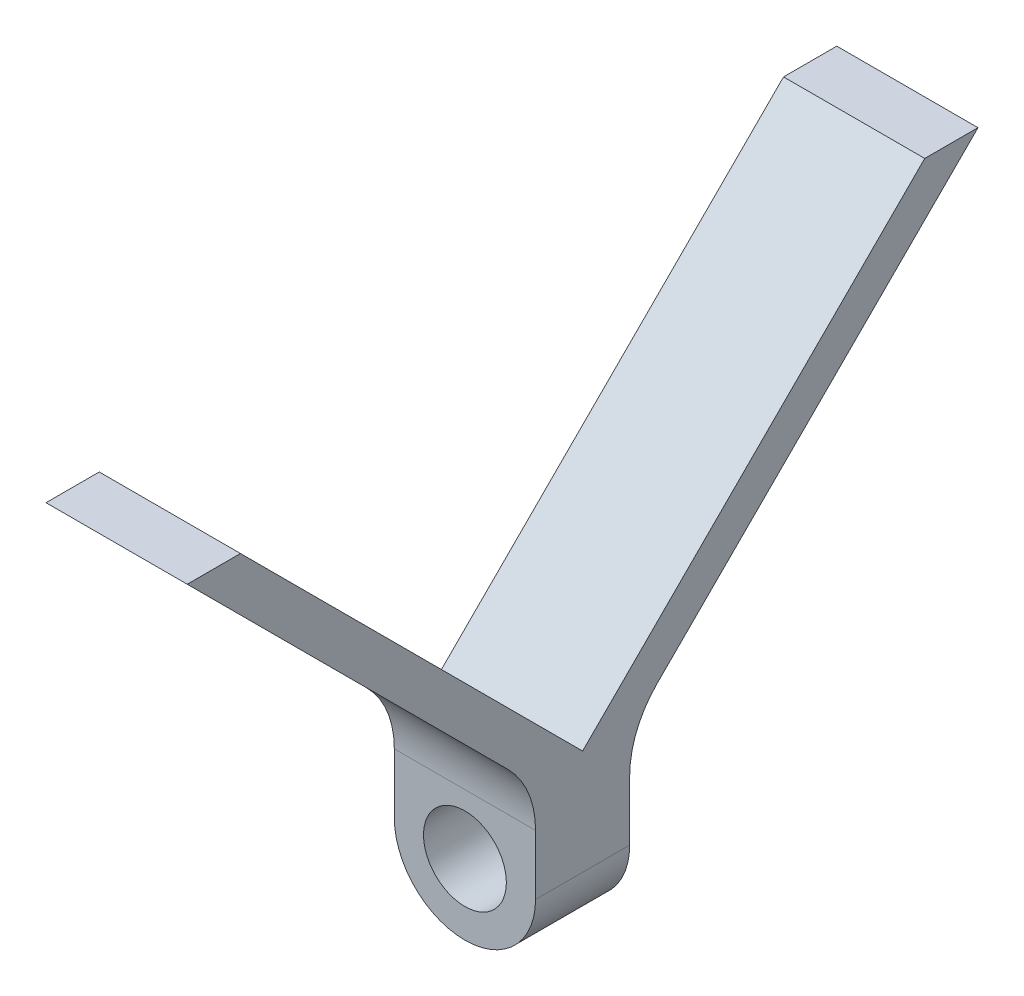
ISO-10303-21;
HEADER;
FILE_DESCRIPTION(('STEP AP214'),'2;1');
FILE_NAME('part.step','',(''),(''),'','','');
FILE_SCHEMA(('AUTOMOTIVE_DESIGN { 1 0 10303 214 1 1 1 1 }'));
ENDSEC;
DATA;
#1=APPLICATION_CONTEXT('core data for automotive mechanical design processes');
#2=APPLICATION_PROTOCOL_DEFINITION('international standard','automotive_design',2000,#1);
#3=PRODUCT_CONTEXT('',#1,'mechanical');
#4=PRODUCT('Part','Part','',(#3));
#5=PRODUCT_RELATED_PRODUCT_CATEGORY('part','',(#4));
#6=PRODUCT_DEFINITION_FORMATION('','',#4);
#7=PRODUCT_DEFINITION_CONTEXT('part definition',#1,'design');
#8=PRODUCT_DEFINITION('design','',#6,#7);
#9=PRODUCT_DEFINITION_SHAPE('','',#8);
#10=(LENGTH_UNIT() NAMED_UNIT(*) SI_UNIT(.MILLI.,.METRE.));
#11=(NAMED_UNIT(*) PLANE_ANGLE_UNIT() SI_UNIT($,.RADIAN.));
#12=(NAMED_UNIT(*) SI_UNIT($,.STERADIAN.) SOLID_ANGLE_UNIT());
#13=UNCERTAINTY_MEASURE_WITH_UNIT(LENGTH_MEASURE(1.E-05),#10,'distance_accuracy_value','');
#14=(GEOMETRIC_REPRESENTATION_CONTEXT(3) GLOBAL_UNCERTAINTY_ASSIGNED_CONTEXT((#13)) GLOBAL_UNIT_ASSIGNED_CONTEXT((#10,
#11,#12)) REPRESENTATION_CONTEXT('',''));
#15=CARTESIAN_POINT('',(0.,0.,0.));
#16=DIRECTION('',(0.,0.,1.));
#17=DIRECTION('',(1.,0.,0.));
#18=AXIS2_PLACEMENT_3D('',#15,#16,#17);
#19=CARTESIAN_POINT('',(3.75,3.75,2.5));
#20=DIRECTION('',(-1.,0.,0.));
#21=DIRECTION('',(0.,0.,1.));
#22=AXIS2_PLACEMENT_3D('',#19,#20,#21);
#23=PLANE('',#22);
#24=DIRECTION('',(0.,0.707106781186549,0.707106781186546));
#25=VECTOR('',#24,1.);
#26=CARTESIAN_POINT('',(3.75,23.75,20.9999999999999));
#27=LINE('',#26,#25);
#28=CARTESIAN_POINT('',(3.75,6.71446609406726,3.96446609406725));
#29=VERTEX_POINT('',#28);
#30=CARTESIAN_POINT('',(3.75,23.75,20.9999999999999));
#31=VERTEX_POINT('',#30);
#32=EDGE_CURVE('E170',#29,#31,#27,.T.);
#33=ORIENTED_EDGE('',*,*,#32,.F.);
#34=CARTESIAN_POINT('',(3.75,3.17893218813454,7.5));
#35=DIRECTION('',(-1.,0.,0.));
#36=DIRECTION('',(0.,0.,1.));
#37=AXIS2_PLACEMENT_3D('',#34,#35,#36);
#38=CIRCLE('',#37,5.);
#39=CARTESIAN_POINT('',(3.75,3.17893218813454,2.5));
#40=VERTEX_POINT('',#39);
#41=EDGE_CURVE('E48',#29,#40,#38,.T.);
#42=ORIENTED_EDGE('',*,*,#41,.T.);
#43=DIRECTION('',(0.,1.,0.));
#44=VECTOR('',#43,1.);
#45=CARTESIAN_POINT('',(3.75,3.75,2.5));
#46=LINE('',#45,#44);
#47=CARTESIAN_POINT('',(3.75,0.,2.5));
#48=VERTEX_POINT('',#47);
#49=EDGE_CURVE('E187',#48,#40,#46,.T.);
#50=ORIENTED_EDGE('',*,*,#49,.F.);
#51=DIRECTION('',(0.,0.,-1.));
#52=VECTOR('',#51,1.);
#53=CARTESIAN_POINT('',(3.75,0.,2.5));
#54=LINE('',#53,#52);
#55=CARTESIAN_POINT('',(3.75,0.,-2.5));
#56=VERTEX_POINT('',#55);
#57=EDGE_CURVE('E207',#48,#56,#54,.T.);
#58=ORIENTED_EDGE('',*,*,#57,.T.);
#59=DIRECTION('',(0.,1.,0.));
#60=VECTOR('',#59,1.);
#61=CARTESIAN_POINT('',(3.75,3.75,-2.5));
#62=LINE('',#61,#60);
#63=CARTESIAN_POINT('',(3.75,3.17893218813454,-2.5));
#64=VERTEX_POINT('',#63);
#65=EDGE_CURVE('E198',#56,#64,#62,.T.);
#66=ORIENTED_EDGE('',*,*,#65,.T.);
#67=CARTESIAN_POINT('',(3.75,3.17893218813454,-7.5));
#68=DIRECTION('',(-1.,0.,0.));
#69=DIRECTION('',(0.,0.,1.));
#70=AXIS2_PLACEMENT_3D('',#67,#68,#69);
#71=CIRCLE('',#70,5.);
#72=CARTESIAN_POINT('',(3.75,6.71446609406727,-3.96446609406726));
#73=VERTEX_POINT('',#72);
#74=EDGE_CURVE('E229',#64,#73,#71,.T.);
#75=ORIENTED_EDGE('',*,*,#74,.T.);
#76=DIRECTION('',(0.,-0.707106781186549,0.707106781186546));
#77=VECTOR('',#76,1.);
#78=CARTESIAN_POINT('',(3.75,2.75,0.));
#79=LINE('',#78,#77);
#80=CARTESIAN_POINT('',(3.75,23.75,-20.9999999999999));
#81=VERTEX_POINT('',#80);
#82=EDGE_CURVE('E166',#81,#73,#79,.T.);
#83=ORIENTED_EDGE('',*,*,#82,.F.);
#84=DIRECTION('',(0.,0.,-1.));
#85=VECTOR('',#84,1.);
#86=CARTESIAN_POINT('',(3.75,23.75,-20.9999999999999));
#87=LINE('',#86,#85);
#88=CARTESIAN_POINT('',(3.75,23.75,-18.1715728752538));
#89=VERTEX_POINT('',#88);
#90=EDGE_CURVE('E180',#89,#81,#87,.T.);
#91=ORIENTED_EDGE('',*,*,#90,.F.);
#92=DIRECTION('',(0.,0.707106781186548,-0.707106781186547));
#93=VECTOR('',#92,1.);
#94=CARTESIAN_POINT('',(3.75,3.41421356237309,2.16421356237309));
#95=LINE('',#94,#93);
#96=CARTESIAN_POINT('',(3.75,5.57842712474619,0.));
#97=VERTEX_POINT('',#96);
#98=EDGE_CURVE('E266',#97,#89,#95,.T.);
#99=ORIENTED_EDGE('',*,*,#98,.F.);
#100=DIRECTION('',(0.,-0.707106781186547,-0.707106781186548));
#101=VECTOR('',#100,1.);
#102=CARTESIAN_POINT('',(3.75,5.9142135623731,0.335786437626903));
#103=LINE('',#102,#101);
#104=CARTESIAN_POINT('',(3.75,23.75,18.1715728752538));
#105=VERTEX_POINT('',#104);
#106=EDGE_CURVE('E159',#105,#97,#103,.T.);
#107=ORIENTED_EDGE('',*,*,#106,.F.);
#108=EDGE_CURVE('E142',#31,#105,#87,.T.);
#109=ORIENTED_EDGE('',*,*,#108,.F.);
#110=EDGE_LOOP('',(#33,#42,#50,#58,#66,#75,#83,#91,#99,#107,#109));
#111=FACE_BOUND('',#110,.T.);
#112=ADVANCED_FACE('F39',(#111),#23,.F.);
#113=CARTESIAN_POINT('',(-3.75,0.,2.5));
#114=DIRECTION('',(1.,0.,0.));
#115=DIRECTION('',(0.,0.,-1.));
#116=AXIS2_PLACEMENT_3D('',#113,#114,#115);
#117=PLANE('',#116);
#118=DIRECTION('',(0.,-0.707106781186549,0.707106781186546));
#119=VECTOR('',#118,1.);
#120=CARTESIAN_POINT('',(-3.75,2.75,0.));
#121=LINE('',#120,#119);
#122=CARTESIAN_POINT('',(-3.75,23.75,-20.9999999999999));
#123=VERTEX_POINT('',#122);
#124=CARTESIAN_POINT('',(-3.75,6.71446609406727,-3.96446609406726));
#125=VERTEX_POINT('',#124);
#126=EDGE_CURVE('E157',#123,#125,#121,.T.);
#127=ORIENTED_EDGE('',*,*,#126,.T.);
#128=CARTESIAN_POINT('',(-3.75,3.17893218813454,-7.5));
#129=DIRECTION('',(1.,0.,0.));
#130=DIRECTION('',(0.,0.,-1.));
#131=AXIS2_PLACEMENT_3D('',#128,#129,#130);
#132=CIRCLE('',#131,5.);
#133=CARTESIAN_POINT('',(-3.75,3.17893218813454,-2.5));
#134=VERTEX_POINT('',#133);
#135=EDGE_CURVE('E232',#125,#134,#132,.T.);
#136=ORIENTED_EDGE('',*,*,#135,.T.);
#137=DIRECTION('',(0.,-1.,0.));
#138=VECTOR('',#137,1.);
#139=CARTESIAN_POINT('',(-3.75,0.,-2.5));
#140=LINE('',#139,#138);
#141=CARTESIAN_POINT('',(-3.75,0.,-2.5));
#142=VERTEX_POINT('',#141);
#143=EDGE_CURVE('E188',#134,#142,#140,.T.);
#144=ORIENTED_EDGE('',*,*,#143,.T.);
#145=DIRECTION('',(0.,0.,-1.));
#146=VECTOR('',#145,1.);
#147=CARTESIAN_POINT('',(-3.75,0.,2.5));
#148=LINE('',#147,#146);
#149=CARTESIAN_POINT('',(-3.75,0.,2.5));
#150=VERTEX_POINT('',#149);
#151=EDGE_CURVE('E194',#150,#142,#148,.T.);
#152=ORIENTED_EDGE('',*,*,#151,.F.);
#153=DIRECTION('',(0.,-1.,0.));
#154=VECTOR('',#153,1.);
#155=CARTESIAN_POINT('',(-3.75,0.,2.5));
#156=LINE('',#155,#154);
#157=CARTESIAN_POINT('',(-3.75,3.17893218813454,2.5));
#158=VERTEX_POINT('',#157);
#159=EDGE_CURVE('E191',#158,#150,#156,.T.);
#160=ORIENTED_EDGE('',*,*,#159,.F.);
#161=CARTESIAN_POINT('',(-3.75,3.17893218813454,7.5));
#162=DIRECTION('',(1.,0.,0.));
#163=DIRECTION('',(0.,0.,-1.));
#164=AXIS2_PLACEMENT_3D('',#161,#162,#163);
#165=CIRCLE('',#164,5.);
#166=CARTESIAN_POINT('',(-3.75,6.71446609406726,3.96446609406725));
#167=VERTEX_POINT('',#166);
#168=EDGE_CURVE('E11',#158,#167,#165,.T.);
#169=ORIENTED_EDGE('',*,*,#168,.T.);
#170=DIRECTION('',(0.,0.707106781186549,0.707106781186546));
#171=VECTOR('',#170,1.);
#172=CARTESIAN_POINT('',(-3.75,23.75,20.9999999999999));
#173=LINE('',#172,#171);
#174=CARTESIAN_POINT('',(-3.75,23.75,20.9999999999999));
#175=VERTEX_POINT('',#174);
#176=EDGE_CURVE('E150',#167,#175,#173,.T.);
#177=ORIENTED_EDGE('',*,*,#176,.T.);
#178=DIRECTION('',(0.,0.,-1.));
#179=VECTOR('',#178,1.);
#180=CARTESIAN_POINT('',(-3.75,23.75,-20.9999999999999));
#181=LINE('',#180,#179);
#182=CARTESIAN_POINT('',(-3.75,23.75,18.1715728752538));
#183=VERTEX_POINT('',#182);
#184=EDGE_CURVE('E140',#175,#183,#181,.T.);
#185=ORIENTED_EDGE('',*,*,#184,.T.);
#186=DIRECTION('',(0.,-0.707106781186547,-0.707106781186548));
#187=VECTOR('',#186,1.);
#188=CARTESIAN_POINT('',(-3.75,23.75,18.1715728752538));
#189=LINE('',#188,#187);
#190=CARTESIAN_POINT('',(-3.75,5.57842712474619,0.));
#191=VERTEX_POINT('',#190);
#192=EDGE_CURVE('E120',#183,#191,#189,.T.);
#193=ORIENTED_EDGE('',*,*,#192,.T.);
#194=DIRECTION('',(0.,0.707106781186548,-0.707106781186547));
#195=VECTOR('',#194,1.);
#196=CARTESIAN_POINT('',(-3.75,5.57842712474619,0.));
#197=LINE('',#196,#195);
#198=CARTESIAN_POINT('',(-3.75,23.75,-18.1715728752538));
#199=VERTEX_POINT('',#198);
#200=EDGE_CURVE('E132',#191,#199,#197,.T.);
#201=ORIENTED_EDGE('',*,*,#200,.T.);
#202=EDGE_CURVE('E153',#199,#123,#181,.T.);
#203=ORIENTED_EDGE('',*,*,#202,.T.);
#204=EDGE_LOOP('',(#127,#136,#144,#152,#160,#169,#177,#185,#193,#201,#203));
#205=FACE_BOUND('',#204,.T.);
#206=ADVANCED_FACE('F148',(#205),#117,.F.);
#207=CARTESIAN_POINT('',(50.7074275274955,23.75,-20.9999999999999));
#208=DIRECTION('',(0.,-1.,0.));
#209=DIRECTION('',(0.,0.,-1.));
#210=AXIS2_PLACEMENT_3D('',#207,#208,#209);
#211=PLANE('',#210);
#212=DIRECTION('',(1.,0.,0.));
#213=VECTOR('',#212,1.);
#214=CARTESIAN_POINT('',(50.7074275274955,23.75,18.1715728752538));
#215=LINE('',#214,#213);
#216=EDGE_CURVE('E123',#183,#105,#215,.T.);
#217=ORIENTED_EDGE('',*,*,#216,.F.);
#218=ORIENTED_EDGE('',*,*,#184,.F.);
#219=DIRECTION('',(-1.,0.,0.));
#220=VECTOR('',#219,1.);
#221=CARTESIAN_POINT('',(50.7074275274955,23.75,20.9999999999999));
#222=LINE('',#221,#220);
#223=EDGE_CURVE('E165',#31,#175,#222,.T.);
#224=ORIENTED_EDGE('',*,*,#223,.F.);
#225=ORIENTED_EDGE('',*,*,#108,.T.);
#226=EDGE_LOOP('',(#217,#218,#224,#225));
#227=FACE_BOUND('',#226,.T.);
#228=ADVANCED_FACE('F138',(#227),#211,.F.);
#229=DIRECTION('',(-1.,0.,0.));
#230=VECTOR('',#229,1.);
#231=CARTESIAN_POINT('',(50.7074275274955,23.75,-18.1715728752538));
#232=LINE('',#231,#230);
#233=EDGE_CURVE('E145',#89,#199,#232,.T.);
#234=ORIENTED_EDGE('',*,*,#233,.F.);
#235=ORIENTED_EDGE('',*,*,#90,.T.);
#236=DIRECTION('',(-1.,0.,0.));
#237=VECTOR('',#236,1.);
#238=CARTESIAN_POINT('',(50.7074275274955,23.75,-20.9999999999999));
#239=LINE('',#238,#237);
#240=EDGE_CURVE('E176',#81,#123,#239,.T.);
#241=ORIENTED_EDGE('',*,*,#240,.T.);
#242=ORIENTED_EDGE('',*,*,#202,.F.);
#243=EDGE_LOOP('',(#234,#235,#241,#242));
#244=FACE_BOUND('',#243,.T.);
#245=ADVANCED_FACE('F240',(#244),#211,.F.);
#246=CARTESIAN_POINT('',(0.,0.,2.5));
#247=DIRECTION('',(0.,0.,-1.));
#248=DIRECTION('',(-1.,0.,0.));
#249=AXIS2_PLACEMENT_3D('',#246,#247,#248);
#250=CYLINDRICAL_SURFACE('',#249,3.75);
#251=CARTESIAN_POINT('',(0.,0.,-2.5));
#252=DIRECTION('',(0.,0.,1.));
#253=DIRECTION('',(1.,0.,0.));
#254=AXIS2_PLACEMENT_3D('',#251,#252,#253);
#255=CIRCLE('',#254,3.75);
#256=EDGE_CURVE('E173',#142,#56,#255,.T.);
#257=ORIENTED_EDGE('',*,*,#256,.T.);
#258=ORIENTED_EDGE('',*,*,#57,.F.);
#259=CARTESIAN_POINT('',(0.,0.,2.5));
#260=DIRECTION('',(0.,0.,1.));
#261=DIRECTION('',(1.,0.,0.));
#262=AXIS2_PLACEMENT_3D('',#259,#260,#261);
#263=CIRCLE('',#262,3.75);
#264=EDGE_CURVE('E183',#150,#48,#263,.T.);
#265=ORIENTED_EDGE('',*,*,#264,.F.);
#266=ORIENTED_EDGE('',*,*,#151,.T.);
#267=EDGE_LOOP('',(#257,#258,#265,#266));
#268=FACE_BOUND('',#267,.T.);
#269=ADVANCED_FACE('F259',(#268),#250,.T.);
#270=CARTESIAN_POINT('',(0.,0.,2.5));
#271=DIRECTION('',(0.,0.,1.));
#272=DIRECTION('',(1.,0.,0.));
#273=AXIS2_PLACEMENT_3D('',#270,#271,#272);
#274=PLANE('',#273);
#275=CARTESIAN_POINT('',(0.,0.,2.5));
#276=DIRECTION('',(0.,0.,1.));
#277=DIRECTION('',(1.,0.,0.));
#278=AXIS2_PLACEMENT_3D('',#275,#276,#277);
#279=CIRCLE('',#278,2.2);
#280=CARTESIAN_POINT('',(2.2,0.,2.5));
#281=VERTEX_POINT('',#280);
#282=EDGE_CURVE('E216',#281,#281,#279,.T.);
#283=ORIENTED_EDGE('',*,*,#282,.F.);
#284=EDGE_LOOP('',(#283));
#285=FACE_BOUND('',#284,.T.);
#286=ORIENTED_EDGE('',*,*,#49,.T.);
#287=DIRECTION('',(1.,0.,0.));
#288=VECTOR('',#287,1.);
#289=CARTESIAN_POINT('',(0.,3.17893218813454,2.5));
#290=LINE('',#289,#288);
#291=EDGE_CURVE('E55',#40,#158,#290,.F.);
#292=ORIENTED_EDGE('',*,*,#291,.T.);
#293=ORIENTED_EDGE('',*,*,#159,.T.);
#294=ORIENTED_EDGE('',*,*,#264,.T.);
#295=EDGE_LOOP('',(#286,#292,#293,#294));
#296=FACE_BOUND('',#295,.T.);
#297=ADVANCED_FACE('F282',(#285,#296),#274,.T.);
#298=CARTESIAN_POINT('',(0.,0.,-2.5));
#299=DIRECTION('',(0.,0.,1.));
#300=DIRECTION('',(1.,0.,0.));
#301=AXIS2_PLACEMENT_3D('',#298,#299,#300);
#302=PLANE('',#301);
#303=CARTESIAN_POINT('',(0.,0.,-2.5));
#304=DIRECTION('',(0.,0.,1.));
#305=DIRECTION('',(1.,0.,0.));
#306=AXIS2_PLACEMENT_3D('',#303,#304,#305);
#307=CIRCLE('',#306,2.2);
#308=CARTESIAN_POINT('',(2.2,0.,-2.5));
#309=VERTEX_POINT('',#308);
#310=EDGE_CURVE('E133',#309,#309,#307,.T.);
#311=ORIENTED_EDGE('',*,*,#310,.T.);
#312=EDGE_LOOP('',(#311));
#313=FACE_BOUND('',#312,.T.);
#314=ORIENTED_EDGE('',*,*,#143,.F.);
#315=DIRECTION('',(1.,0.,0.));
#316=VECTOR('',#315,1.);
#317=CARTESIAN_POINT('',(3.75,3.17893218813454,-2.5));
#318=LINE('',#317,#316);
#319=EDGE_CURVE('E144',#134,#64,#318,.T.);
#320=ORIENTED_EDGE('',*,*,#319,.T.);
#321=ORIENTED_EDGE('',*,*,#65,.F.);
#322=ORIENTED_EDGE('',*,*,#256,.F.);
#323=EDGE_LOOP('',(#314,#320,#321,#322));
#324=FACE_BOUND('',#323,.T.);
#325=ADVANCED_FACE('F254',(#313,#324),#302,.F.);
#326=CARTESIAN_POINT('',(50.7074275274955,2.75,0.));
#327=DIRECTION('',(0.,0.707106781186546,0.707106781186549));
#328=DIRECTION('',(0.,-0.707106781186549,0.707106781186546));
#329=AXIS2_PLACEMENT_3D('',#326,#327,#328);
#330=PLANE('',#329);
#331=ORIENTED_EDGE('',*,*,#82,.T.);
#332=DIRECTION('',(1.,0.,0.));
#333=VECTOR('',#332,1.);
#334=CARTESIAN_POINT('',(-3.75,6.71446609406727,-3.96446609406726));
#335=LINE('',#334,#333);
#336=EDGE_CURVE('E220',#73,#125,#335,.F.);
#337=ORIENTED_EDGE('',*,*,#336,.T.);
#338=ORIENTED_EDGE('',*,*,#126,.F.);
#339=ORIENTED_EDGE('',*,*,#240,.F.);
#340=EDGE_LOOP('',(#331,#337,#338,#339));
#341=FACE_BOUND('',#340,.T.);
#342=ADVANCED_FACE('F247',(#341),#330,.F.);
#343=CARTESIAN_POINT('',(50.7074275274955,23.75,20.9999999999999));
#344=DIRECTION('',(0.,0.707106781186546,-0.707106781186549));
#345=DIRECTION('',(0.,0.707106781186549,0.707106781186546));
#346=AXIS2_PLACEMENT_3D('',#343,#344,#345);
#347=PLANE('',#346);
#348=ORIENTED_EDGE('',*,*,#176,.F.);
#349=DIRECTION('',(1.,0.,0.));
#350=VECTOR('',#349,1.);
#351=CARTESIAN_POINT('',(50.7074275274955,6.71446609406727,3.96446609406726));
#352=LINE('',#351,#350);
#353=EDGE_CURVE('E223',#167,#29,#352,.T.);
#354=ORIENTED_EDGE('',*,*,#353,.T.);
#355=ORIENTED_EDGE('',*,*,#32,.T.);
#356=ORIENTED_EDGE('',*,*,#223,.T.);
#357=EDGE_LOOP('',(#348,#354,#355,#356));
#358=FACE_BOUND('',#357,.T.);
#359=ADVANCED_FACE('F265',(#358),#347,.F.);
#360=CARTESIAN_POINT('',(3.750012,23.75,18.1715728752538));
#361=DIRECTION('',(0.,0.707106781186548,-0.707106781186547));
#362=DIRECTION('',(0.,0.707106781186547,0.707106781186548));
#363=AXIS2_PLACEMENT_3D('',#360,#361,#362);
#364=PLANE('',#363);
#365=ORIENTED_EDGE('',*,*,#106,.T.);
#366=DIRECTION('',(-1.,0.,0.));
#367=VECTOR('',#366,1.);
#368=CARTESIAN_POINT('',(3.750012,5.57842712474619,0.));
#369=LINE('',#368,#367);
#370=EDGE_CURVE('E126',#97,#191,#369,.T.);
#371=ORIENTED_EDGE('',*,*,#370,.T.);
#372=ORIENTED_EDGE('',*,*,#192,.F.);
#373=ORIENTED_EDGE('',*,*,#216,.T.);
#374=EDGE_LOOP('',(#365,#371,#372,#373));
#375=FACE_BOUND('',#374,.T.);
#376=ADVANCED_FACE('F122',(#375),#364,.T.);
#377=CARTESIAN_POINT('',(3.750012,5.57842712474619,0.));
#378=DIRECTION('',(0.,0.707106781186547,0.707106781186548));
#379=DIRECTION('',(0.,-0.707106781186548,0.707106781186547));
#380=AXIS2_PLACEMENT_3D('',#377,#378,#379);
#381=PLANE('',#380);
#382=ORIENTED_EDGE('',*,*,#98,.T.);
#383=ORIENTED_EDGE('',*,*,#233,.T.);
#384=ORIENTED_EDGE('',*,*,#200,.F.);
#385=ORIENTED_EDGE('',*,*,#370,.F.);
#386=EDGE_LOOP('',(#382,#383,#384,#385));
#387=FACE_BOUND('',#386,.T.);
#388=ADVANCED_FACE('F304',(#387),#381,.T.);
#389=CARTESIAN_POINT('',(0.,0.,-7.5));
#390=DIRECTION('',(0.,0.,1.));
#391=DIRECTION('',(1.,0.,0.));
#392=AXIS2_PLACEMENT_3D('',#389,#390,#391);
#393=CYLINDRICAL_SURFACE('',#392,2.2);
#394=ORIENTED_EDGE('',*,*,#282,.T.);
#395=EDGE_LOOP('',(#394));
#396=FACE_BOUND('',#395,.T.);
#397=ORIENTED_EDGE('',*,*,#310,.F.);
#398=EDGE_LOOP('',(#397));
#399=FACE_BOUND('',#398,.T.);
#400=ADVANCED_FACE('F279',(#396,#399),#393,.F.);
#401=CARTESIAN_POINT('',(0.,3.17893218813454,-7.5));
#402=DIRECTION('',(-1.,0.,0.));
#403=DIRECTION('',(0.,0.,1.));
#404=AXIS2_PLACEMENT_3D('',#401,#402,#403);
#405=CYLINDRICAL_SURFACE('',#404,5.);
#406=ORIENTED_EDGE('',*,*,#135,.F.);
#407=ORIENTED_EDGE('',*,*,#336,.F.);
#408=ORIENTED_EDGE('',*,*,#74,.F.);
#409=ORIENTED_EDGE('',*,*,#319,.F.);
#410=EDGE_LOOP('',(#406,#407,#408,#409));
#411=FACE_BOUND('',#410,.T.);
#412=ADVANCED_FACE('F252',(#411),#405,.F.);
#413=CARTESIAN_POINT('',(50.7074275274955,3.17893218813454,7.5));
#414=DIRECTION('',(1.,0.,0.));
#415=DIRECTION('',(0.,0.,-1.));
#416=AXIS2_PLACEMENT_3D('',#413,#414,#415);
#417=CYLINDRICAL_SURFACE('',#416,5.);
#418=ORIENTED_EDGE('',*,*,#168,.F.);
#419=ORIENTED_EDGE('',*,*,#291,.F.);
#420=ORIENTED_EDGE('',*,*,#41,.F.);
#421=ORIENTED_EDGE('',*,*,#353,.F.);
#422=EDGE_LOOP('',(#418,#419,#420,#421));
#423=FACE_BOUND('',#422,.T.);
#424=ADVANCED_FACE('F41',(#423),#417,.F.);
#425=CLOSED_SHELL('',(#112,#206,#228,#245,#269,#297,#325,#342,#359,#376,#388,#400,#412,#424));
#426=MANIFOLD_SOLID_BREP('B2',#425);
#427=ADVANCED_BREP_SHAPE_REPRESENTATION('',(#18,#426),#14);
#428=SHAPE_DEFINITION_REPRESENTATION(#9,#427);
ENDSEC;
END-ISO-10303-21;
